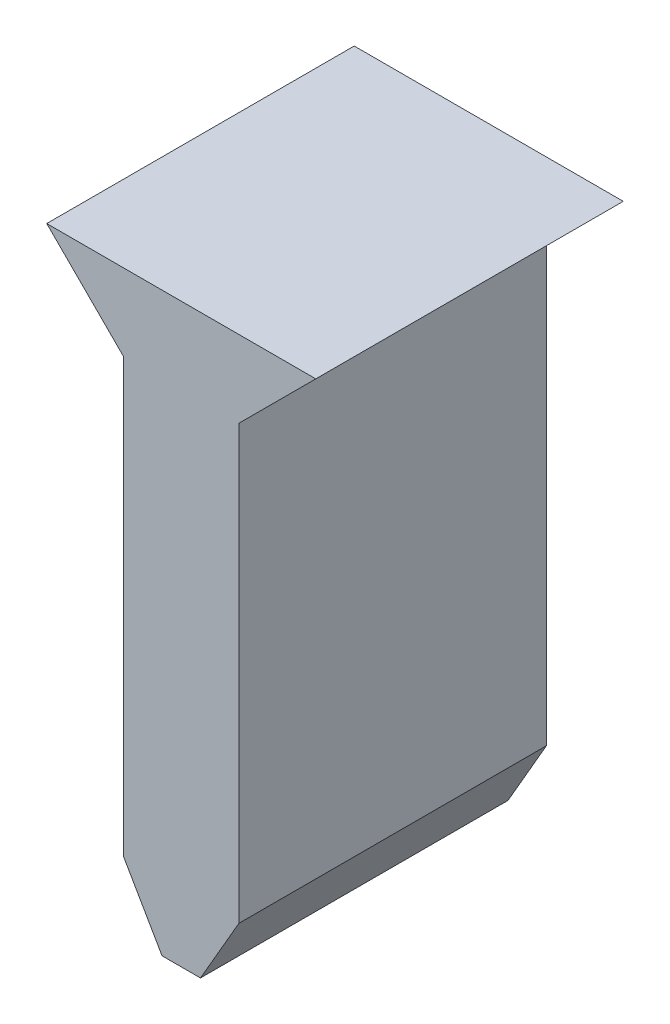
ISO-10303-21;
HEADER;
FILE_DESCRIPTION(('STEP AP214'),'2;1');
FILE_NAME('part.step','',(''),(''),'','','');
FILE_SCHEMA(('AUTOMOTIVE_DESIGN { 1 0 10303 214 1 1 1 1 }'));
ENDSEC;
DATA;
#1=APPLICATION_CONTEXT('core data for automotive mechanical design processes');
#2=APPLICATION_PROTOCOL_DEFINITION('international standard','automotive_design',2000,#1);
#3=PRODUCT_CONTEXT('',#1,'mechanical');
#4=PRODUCT('Part','Part','',(#3));
#5=PRODUCT_RELATED_PRODUCT_CATEGORY('part','',(#4));
#6=PRODUCT_DEFINITION_FORMATION('','',#4);
#7=PRODUCT_DEFINITION_CONTEXT('part definition',#1,'design');
#8=PRODUCT_DEFINITION('design','',#6,#7);
#9=PRODUCT_DEFINITION_SHAPE('','',#8);
#10=(LENGTH_UNIT() NAMED_UNIT(*) SI_UNIT(.MILLI.,.METRE.));
#11=(NAMED_UNIT(*) PLANE_ANGLE_UNIT() SI_UNIT($,.RADIAN.));
#12=(NAMED_UNIT(*) SI_UNIT($,.STERADIAN.) SOLID_ANGLE_UNIT());
#13=UNCERTAINTY_MEASURE_WITH_UNIT(LENGTH_MEASURE(1.E-05),#10,'distance_accuracy_value','');
#14=(GEOMETRIC_REPRESENTATION_CONTEXT(3) GLOBAL_UNCERTAINTY_ASSIGNED_CONTEXT((#13)) GLOBAL_UNIT_ASSIGNED_CONTEXT((#10,
#11,#12)) REPRESENTATION_CONTEXT('',''));
#15=CARTESIAN_POINT('',(0.,0.,0.));
#16=DIRECTION('',(0.,0.,1.));
#17=DIRECTION('',(1.,0.,0.));
#18=AXIS2_PLACEMENT_3D('',#15,#16,#17);
#19=CARTESIAN_POINT('',(1.5,6.5,4.));
#20=DIRECTION('',(-1.,0.,0.));
#21=DIRECTION('',(0.,-1.,0.));
#22=AXIS2_PLACEMENT_3D('',#19,#20,#21);
#23=PLANE('',#22);
#24=DIRECTION('',(0.,1.,0.));
#25=VECTOR('',#24,1.);
#26=CARTESIAN_POINT('',(1.5,6.5,4.));
#27=LINE('',#26,#25);
#28=CARTESIAN_POINT('',(1.5,-4.76794919243112,4.));
#29=VERTEX_POINT('',#28);
#30=CARTESIAN_POINT('',(1.5,6.5,4.));
#31=VERTEX_POINT('',#30);
#32=EDGE_CURVE('E141',#29,#31,#27,.T.);
#33=ORIENTED_EDGE('',*,*,#32,.F.);
#34=DIRECTION('',(0.,0.,-1.));
#35=VECTOR('',#34,1.);
#36=CARTESIAN_POINT('',(1.5,-4.76794919243112,4.));
#37=LINE('',#36,#35);
#38=CARTESIAN_POINT('',(1.5,-4.76794919243112,-4.));
#39=VERTEX_POINT('',#38);
#40=EDGE_CURVE('E11',#29,#39,#37,.T.);
#41=ORIENTED_EDGE('',*,*,#40,.T.);
#42=DIRECTION('',(0.,1.,0.));
#43=VECTOR('',#42,1.);
#44=CARTESIAN_POINT('',(1.5,6.5,-4.));
#45=LINE('',#44,#43);
#46=CARTESIAN_POINT('',(1.5,6.5,-4.));
#47=VERTEX_POINT('',#46);
#48=EDGE_CURVE('E100',#39,#47,#45,.T.);
#49=ORIENTED_EDGE('',*,*,#48,.T.);
#50=DIRECTION('',(0.,0.,-1.));
#51=VECTOR('',#50,1.);
#52=CARTESIAN_POINT('',(1.5,6.5,4.));
#53=LINE('',#52,#51);
#54=EDGE_CURVE('E102',#31,#47,#53,.T.);
#55=ORIENTED_EDGE('',*,*,#54,.F.);
#56=EDGE_LOOP('',(#33,#41,#49,#55));
#57=FACE_BOUND('',#56,.T.);
#58=ADVANCED_FACE('F33',(#57),#23,.F.);
#59=CARTESIAN_POINT('',(-1.5,6.5,4.));
#60=DIRECTION('',(1.,0.,0.));
#61=DIRECTION('',(0.,1.,0.));
#62=AXIS2_PLACEMENT_3D('',#59,#60,#61);
#63=PLANE('',#62);
#64=DIRECTION('',(0.,-1.,0.));
#65=VECTOR('',#64,1.);
#66=CARTESIAN_POINT('',(-1.5,6.5,-4.));
#67=LINE('',#66,#65);
#68=CARTESIAN_POINT('',(-1.5,6.5,-4.));
#69=VERTEX_POINT('',#68);
#70=CARTESIAN_POINT('',(-1.5,-4.76794919243111,-4.));
#71=VERTEX_POINT('',#70);
#72=EDGE_CURVE('E107',#69,#71,#67,.T.);
#73=ORIENTED_EDGE('',*,*,#72,.T.);
#74=DIRECTION('',(0.,0.,1.));
#75=VECTOR('',#74,1.);
#76=CARTESIAN_POINT('',(-1.5,-4.76794919243112,4.));
#77=LINE('',#76,#75);
#78=CARTESIAN_POINT('',(-1.5,-4.76794919243111,4.));
#79=VERTEX_POINT('',#78);
#80=EDGE_CURVE('E56',#71,#79,#77,.T.);
#81=ORIENTED_EDGE('',*,*,#80,.T.);
#82=DIRECTION('',(0.,-1.,0.));
#83=VECTOR('',#82,1.);
#84=CARTESIAN_POINT('',(-1.5,6.5,4.));
#85=LINE('',#84,#83);
#86=CARTESIAN_POINT('',(-1.5,6.5,4.));
#87=VERTEX_POINT('',#86);
#88=EDGE_CURVE('E143',#87,#79,#85,.T.);
#89=ORIENTED_EDGE('',*,*,#88,.F.);
#90=DIRECTION('',(0.,0.,-1.));
#91=VECTOR('',#90,1.);
#92=CARTESIAN_POINT('',(-1.5,6.5,4.));
#93=LINE('',#92,#91);
#94=EDGE_CURVE('E117',#87,#69,#93,.T.);
#95=ORIENTED_EDGE('',*,*,#94,.T.);
#96=EDGE_LOOP('',(#73,#81,#89,#95));
#97=FACE_BOUND('',#96,.T.);
#98=ADVANCED_FACE('F171',(#97),#63,.F.);
#99=CARTESIAN_POINT('',(-1.5,-6.5,4.));
#100=DIRECTION('',(0.,1.,0.));
#101=DIRECTION('',(0.,0.,1.));
#102=AXIS2_PLACEMENT_3D('',#99,#100,#101);
#103=PLANE('',#102);
#104=DIRECTION('',(1.,0.,0.));
#105=VECTOR('',#104,1.);
#106=CARTESIAN_POINT('',(-1.5,-6.5,4.));
#107=LINE('',#106,#105);
#108=CARTESIAN_POINT('',(-0.499999999999993,-6.5,4.));
#109=VERTEX_POINT('',#108);
#110=CARTESIAN_POINT('',(0.499999999999997,-6.5,4.));
#111=VERTEX_POINT('',#110);
#112=EDGE_CURVE('E146',#109,#111,#107,.T.);
#113=ORIENTED_EDGE('',*,*,#112,.F.);
#114=DIRECTION('',(0.,0.,-1.));
#115=VECTOR('',#114,1.);
#116=CARTESIAN_POINT('',(-0.499999999999993,-6.5,4.));
#117=LINE('',#116,#115);
#118=CARTESIAN_POINT('',(-0.499999999999994,-6.5,-4.));
#119=VERTEX_POINT('',#118);
#120=EDGE_CURVE('E153',#109,#119,#117,.T.);
#121=ORIENTED_EDGE('',*,*,#120,.T.);
#122=DIRECTION('',(1.,0.,0.));
#123=VECTOR('',#122,1.);
#124=CARTESIAN_POINT('',(-1.5,-6.5,-4.));
#125=LINE('',#124,#123);
#126=CARTESIAN_POINT('',(0.499999999999997,-6.5,-4.));
#127=VERTEX_POINT('',#126);
#128=EDGE_CURVE('E144',#119,#127,#125,.T.);
#129=ORIENTED_EDGE('',*,*,#128,.T.);
#130=DIRECTION('',(0.,0.,1.));
#131=VECTOR('',#130,1.);
#132=CARTESIAN_POINT('',(0.499999999999997,-6.5,4.));
#133=LINE('',#132,#131);
#134=EDGE_CURVE('E116',#127,#111,#133,.T.);
#135=ORIENTED_EDGE('',*,*,#134,.T.);
#136=EDGE_LOOP('',(#113,#121,#129,#135));
#137=FACE_BOUND('',#136,.T.);
#138=ADVANCED_FACE('F167',(#137),#103,.F.);
#139=CARTESIAN_POINT('',(0.,0.,4.));
#140=DIRECTION('',(0.,0.,1.));
#141=DIRECTION('',(1.,0.,0.));
#142=AXIS2_PLACEMENT_3D('',#139,#140,#141);
#143=PLANE('',#142);
#144=ORIENTED_EDGE('',*,*,#88,.T.);
#145=DIRECTION('',(-0.500000000000001,0.866025403784438,0.));
#146=VECTOR('',#145,1.);
#147=CARTESIAN_POINT('',(-3.18958256229942,-1.84150635094612,4.));
#148=LINE('',#147,#146);
#149=EDGE_CURVE('E41',#79,#109,#148,.F.);
#150=ORIENTED_EDGE('',*,*,#149,.T.);
#151=ORIENTED_EDGE('',*,*,#112,.T.);
#152=DIRECTION('',(-0.500000000000001,-0.866025403784438,0.));
#153=VECTOR('',#152,1.);
#154=CARTESIAN_POINT('',(3.18958256229943,-1.84150635094612,4.));
#155=LINE('',#154,#153);
#156=EDGE_CURVE('E48',#111,#29,#155,.F.);
#157=ORIENTED_EDGE('',*,*,#156,.T.);
#158=ORIENTED_EDGE('',*,*,#32,.T.);
#159=DIRECTION('',(0.707106781186547,0.707106781186549,0.));
#160=VECTOR('',#159,1.);
#161=CARTESIAN_POINT('',(3.49999999999999,8.5,4.));
#162=LINE('',#161,#160);
#163=CARTESIAN_POINT('',(3.49999999999999,8.5,4.));
#164=VERTEX_POINT('',#163);
#165=EDGE_CURVE('E115',#31,#164,#162,.T.);
#166=ORIENTED_EDGE('',*,*,#165,.T.);
#167=DIRECTION('',(-1.,0.,0.));
#168=VECTOR('',#167,1.);
#169=CARTESIAN_POINT('',(-3.49999999999999,8.5,4.));
#170=LINE('',#169,#168);
#171=CARTESIAN_POINT('',(-3.49999999999999,8.5,4.));
#172=VERTEX_POINT('',#171);
#173=EDGE_CURVE('E130',#164,#172,#170,.T.);
#174=ORIENTED_EDGE('',*,*,#173,.T.);
#175=DIRECTION('',(0.707106781186546,-0.707106781186549,0.));
#176=VECTOR('',#175,1.);
#177=CARTESIAN_POINT('',(-1.5,6.5,4.));
#178=LINE('',#177,#176);
#179=EDGE_CURVE('E125',#172,#87,#178,.T.);
#180=ORIENTED_EDGE('',*,*,#179,.T.);
#181=EDGE_LOOP('',(#144,#150,#151,#157,#158,#166,#174,#180));
#182=FACE_BOUND('',#181,.T.);
#183=ADVANCED_FACE('F163',(#182),#143,.T.);
#184=CARTESIAN_POINT('',(0.,0.,-4.));
#185=DIRECTION('',(0.,0.,1.));
#186=DIRECTION('',(1.,0.,0.));
#187=AXIS2_PLACEMENT_3D('',#184,#185,#186);
#188=PLANE('',#187);
#189=ORIENTED_EDGE('',*,*,#128,.F.);
#190=DIRECTION('',(0.500000000000001,-0.866025403784438,0.));
#191=VECTOR('',#190,1.);
#192=CARTESIAN_POINT('',(-0.499999999999993,-6.5,-4.));
#193=LINE('',#192,#191);
#194=EDGE_CURVE('E158',#119,#71,#193,.F.);
#195=ORIENTED_EDGE('',*,*,#194,.T.);
#196=ORIENTED_EDGE('',*,*,#72,.F.);
#197=DIRECTION('',(0.707106781186546,-0.707106781186549,0.));
#198=VECTOR('',#197,1.);
#199=CARTESIAN_POINT('',(-1.5,6.5,-4.));
#200=LINE('',#199,#198);
#201=CARTESIAN_POINT('',(-3.49999999999999,8.5,-4.));
#202=VERTEX_POINT('',#201);
#203=EDGE_CURVE('E127',#202,#69,#200,.T.);
#204=ORIENTED_EDGE('',*,*,#203,.F.);
#205=DIRECTION('',(-1.,0.,0.));
#206=VECTOR('',#205,1.);
#207=CARTESIAN_POINT('',(-3.49999999999999,8.5,-4.));
#208=LINE('',#207,#206);
#209=CARTESIAN_POINT('',(3.49999999999999,8.5,-4.));
#210=VERTEX_POINT('',#209);
#211=EDGE_CURVE('E124',#210,#202,#208,.T.);
#212=ORIENTED_EDGE('',*,*,#211,.F.);
#213=DIRECTION('',(0.707106781186547,0.707106781186549,0.));
#214=VECTOR('',#213,1.);
#215=CARTESIAN_POINT('',(3.49999999999999,8.5,-4.));
#216=LINE('',#215,#214);
#217=EDGE_CURVE('E113',#47,#210,#216,.T.);
#218=ORIENTED_EDGE('',*,*,#217,.F.);
#219=ORIENTED_EDGE('',*,*,#48,.F.);
#220=DIRECTION('',(0.500000000000001,0.866025403784438,0.));
#221=VECTOR('',#220,1.);
#222=CARTESIAN_POINT('',(1.5,-4.76794919243112,-4.));
#223=LINE('',#222,#221);
#224=EDGE_CURVE('E156',#39,#127,#223,.F.);
#225=ORIENTED_EDGE('',*,*,#224,.T.);
#226=EDGE_LOOP('',(#189,#195,#196,#204,#212,#218,#219,#225));
#227=FACE_BOUND('',#226,.T.);
#228=ADVANCED_FACE('F121',(#227),#188,.F.);
#229=CARTESIAN_POINT('',(-1.5,6.5,-4.));
#230=DIRECTION('',(-0.707106781186549,-0.707106781186546,0.));
#231=DIRECTION('',(0.707106781186546,-0.707106781186549,0.));
#232=AXIS2_PLACEMENT_3D('',#229,#230,#231);
#233=PLANE('',#232);
#234=ORIENTED_EDGE('',*,*,#179,.F.);
#235=DIRECTION('',(0.,0.,1.));
#236=VECTOR('',#235,1.);
#237=CARTESIAN_POINT('',(-3.49999999999999,8.5,-4.));
#238=LINE('',#237,#236);
#239=EDGE_CURVE('E108',#202,#172,#238,.T.);
#240=ORIENTED_EDGE('',*,*,#239,.F.);
#241=ORIENTED_EDGE('',*,*,#203,.T.);
#242=ORIENTED_EDGE('',*,*,#94,.F.);
#243=EDGE_LOOP('',(#234,#240,#241,#242));
#244=FACE_BOUND('',#243,.T.);
#245=ADVANCED_FACE('F175',(#244),#233,.T.);
#246=CARTESIAN_POINT('',(-3.49999999999999,8.5,-4.));
#247=DIRECTION('',(0.,1.,0.));
#248=DIRECTION('',(0.,0.,1.));
#249=AXIS2_PLACEMENT_3D('',#246,#247,#248);
#250=PLANE('',#249);
#251=ORIENTED_EDGE('',*,*,#173,.F.);
#252=DIRECTION('',(0.,0.,1.));
#253=VECTOR('',#252,1.);
#254=CARTESIAN_POINT('',(3.49999999999999,8.5,-4.));
#255=LINE('',#254,#253);
#256=EDGE_CURVE('E135',#210,#164,#255,.T.);
#257=ORIENTED_EDGE('',*,*,#256,.F.);
#258=ORIENTED_EDGE('',*,*,#211,.T.);
#259=ORIENTED_EDGE('',*,*,#239,.T.);
#260=EDGE_LOOP('',(#251,#257,#258,#259));
#261=FACE_BOUND('',#260,.T.);
#262=ADVANCED_FACE('F178',(#261),#250,.T.);
#263=CARTESIAN_POINT('',(3.49999999999999,8.5,-4.));
#264=DIRECTION('',(0.707106781186549,-0.707106781186547,0.));
#265=DIRECTION('',(0.707106781186547,0.707106781186549,0.));
#266=AXIS2_PLACEMENT_3D('',#263,#264,#265);
#267=PLANE('',#266);
#268=ORIENTED_EDGE('',*,*,#165,.F.);
#269=ORIENTED_EDGE('',*,*,#54,.T.);
#270=ORIENTED_EDGE('',*,*,#217,.T.);
#271=ORIENTED_EDGE('',*,*,#256,.T.);
#272=EDGE_LOOP('',(#268,#269,#270,#271));
#273=FACE_BOUND('',#272,.T.);
#274=ADVANCED_FACE('F112',(#273),#267,.T.);
#275=CARTESIAN_POINT('',(-0.499999999999993,-6.5,4.));
#276=DIRECTION('',(0.866025403784438,0.500000000000001,0.));
#277=DIRECTION('',(0.,0.,-1.));
#278=AXIS2_PLACEMENT_3D('',#275,#276,#277);
#279=PLANE('',#278);
#280=ORIENTED_EDGE('',*,*,#149,.F.);
#281=ORIENTED_EDGE('',*,*,#80,.F.);
#282=ORIENTED_EDGE('',*,*,#194,.F.);
#283=ORIENTED_EDGE('',*,*,#120,.F.);
#284=EDGE_LOOP('',(#280,#281,#282,#283));
#285=FACE_BOUND('',#284,.T.);
#286=ADVANCED_FACE('F169',(#285),#279,.F.);
#287=CARTESIAN_POINT('',(1.5,-4.76794919243112,4.));
#288=DIRECTION('',(-0.866025403784438,0.500000000000001,0.));
#289=DIRECTION('',(0.,0.,-1.));
#290=AXIS2_PLACEMENT_3D('',#287,#288,#289);
#291=PLANE('',#290);
#292=ORIENTED_EDGE('',*,*,#156,.F.);
#293=ORIENTED_EDGE('',*,*,#134,.F.);
#294=ORIENTED_EDGE('',*,*,#224,.F.);
#295=ORIENTED_EDGE('',*,*,#40,.F.);
#296=EDGE_LOOP('',(#292,#293,#294,#295));
#297=FACE_BOUND('',#296,.T.);
#298=ADVANCED_FACE('F35',(#297),#291,.F.);
#299=CLOSED_SHELL('',(#58,#98,#138,#183,#228,#245,#262,#274,#286,#298));
#300=MANIFOLD_SOLID_BREP('B2',#299);
#301=ADVANCED_BREP_SHAPE_REPRESENTATION('',(#18,#300),#14);
#302=SHAPE_DEFINITION_REPRESENTATION(#9,#301);
ENDSEC;
END-ISO-10303-21;
